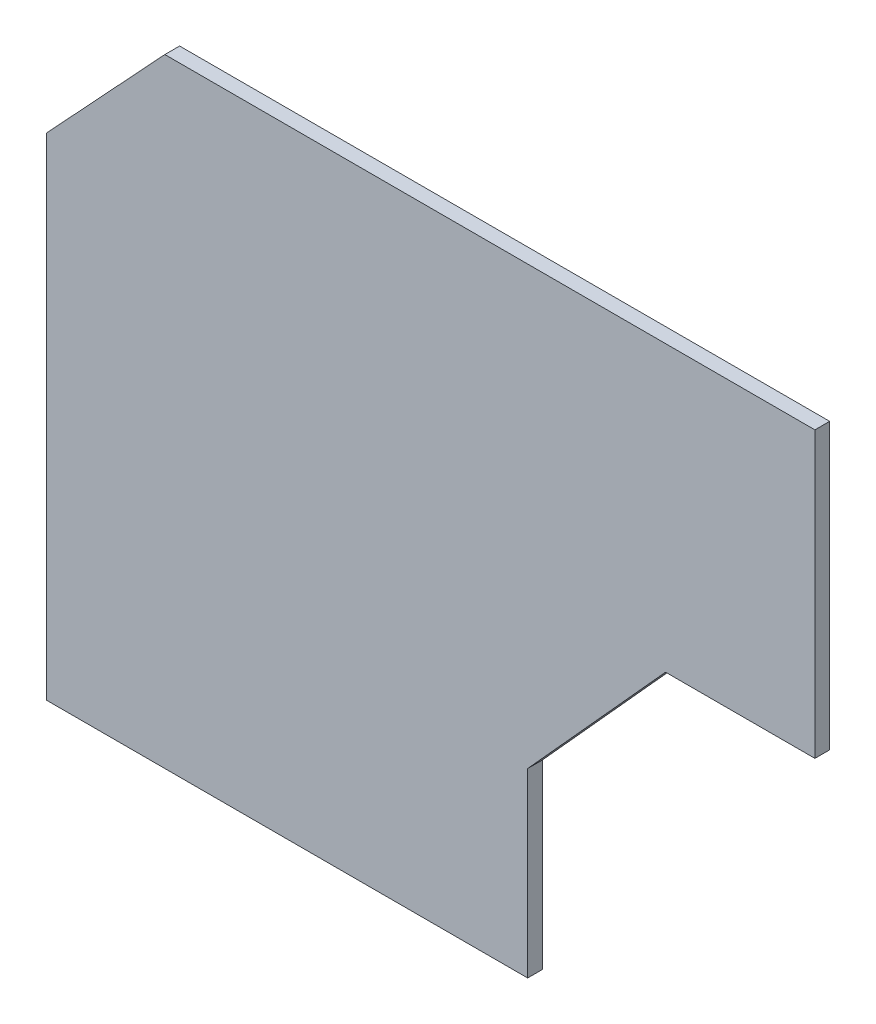
ISO-10303-21;
HEADER;
FILE_DESCRIPTION(('STEP AP214'),'2;1');
FILE_NAME('part.step','',(''),(''),'','','');
FILE_SCHEMA(('AUTOMOTIVE_DESIGN { 1 0 10303 214 1 1 1 1 }'));
ENDSEC;
DATA;
#1=APPLICATION_CONTEXT('core data for automotive mechanical design processes');
#2=APPLICATION_PROTOCOL_DEFINITION('international standard','automotive_design',2000,#1);
#3=PRODUCT_CONTEXT('',#1,'mechanical');
#4=PRODUCT('Part','Part','',(#3));
#5=PRODUCT_RELATED_PRODUCT_CATEGORY('part','',(#4));
#6=PRODUCT_DEFINITION_FORMATION('','',#4);
#7=PRODUCT_DEFINITION_CONTEXT('part definition',#1,'design');
#8=PRODUCT_DEFINITION('design','',#6,#7);
#9=PRODUCT_DEFINITION_SHAPE('','',#8);
#10=(LENGTH_UNIT() NAMED_UNIT(*) SI_UNIT(.MILLI.,.METRE.));
#11=(NAMED_UNIT(*) PLANE_ANGLE_UNIT() SI_UNIT($,.RADIAN.));
#12=(NAMED_UNIT(*) SI_UNIT($,.STERADIAN.) SOLID_ANGLE_UNIT());
#13=UNCERTAINTY_MEASURE_WITH_UNIT(LENGTH_MEASURE(1.E-05),#10,'distance_accuracy_value','');
#14=(GEOMETRIC_REPRESENTATION_CONTEXT(3) GLOBAL_UNCERTAINTY_ASSIGNED_CONTEXT((#13)) GLOBAL_UNIT_ASSIGNED_CONTEXT((#10,
#11,#12)) REPRESENTATION_CONTEXT('',''));
#15=CARTESIAN_POINT('',(0.,0.,0.));
#16=DIRECTION('',(0.,0.,1.));
#17=DIRECTION('',(1.,0.,0.));
#18=AXIS2_PLACEMENT_3D('',#15,#16,#17);
#19=CARTESIAN_POINT('',(-104.012014782512,-83.6777879037961,2.));
#20=DIRECTION('',(1.,0.,0.));
#21=DIRECTION('',(0.,0.,-1.));
#22=AXIS2_PLACEMENT_3D('',#19,#20,#21);
#23=PLANE('',#22);
#24=DIRECTION('',(0.,-1.,0.));
#25=VECTOR('',#24,1.);
#26=CARTESIAN_POINT('',(-104.012014782512,-83.6777879037961,0.));
#27=LINE('',#26,#25);
#28=CARTESIAN_POINT('',(-104.012014782512,-17.2283713863176,0.));
#29=VERTEX_POINT('',#28);
#30=CARTESIAN_POINT('',(-104.012014782512,-83.6777879037961,0.));
#31=VERTEX_POINT('',#30);
#32=EDGE_CURVE('E140',#29,#31,#27,.T.);
#33=ORIENTED_EDGE('',*,*,#32,.T.);
#34=DIRECTION('',(0.,0.,-1.));
#35=VECTOR('',#34,1.);
#36=CARTESIAN_POINT('',(-104.012014782512,-83.6777879037961,2.));
#37=LINE('',#36,#35);
#38=CARTESIAN_POINT('',(-104.012014782512,-83.6777879037961,2.));
#39=VERTEX_POINT('',#38);
#40=EDGE_CURVE('E11',#39,#31,#37,.T.);
#41=ORIENTED_EDGE('',*,*,#40,.F.);
#42=DIRECTION('',(0.,-1.,0.));
#43=VECTOR('',#42,1.);
#44=CARTESIAN_POINT('',(-104.012014782512,-83.6777879037961,2.));
#45=LINE('',#44,#43);
#46=CARTESIAN_POINT('',(-104.012014782512,-17.2283713863176,2.));
#47=VERTEX_POINT('',#46);
#48=EDGE_CURVE('E162',#47,#39,#45,.T.);
#49=ORIENTED_EDGE('',*,*,#48,.F.);
#50=DIRECTION('',(0.,0.,-1.));
#51=VECTOR('',#50,1.);
#52=CARTESIAN_POINT('',(-104.012014782512,-17.2283713863176,2.));
#53=LINE('',#52,#51);
#54=EDGE_CURVE('E136',#47,#29,#53,.T.);
#55=ORIENTED_EDGE('',*,*,#54,.T.);
#56=EDGE_LOOP('',(#33,#41,#49,#55));
#57=FACE_BOUND('',#56,.T.);
#58=ADVANCED_FACE('F39',(#57),#23,.F.);
#59=CARTESIAN_POINT('',(-38.8719463737525,-83.677787903796,2.));
#60=DIRECTION('',(0.,1.,0.));
#61=DIRECTION('',(-1.,0.,0.));
#62=AXIS2_PLACEMENT_3D('',#59,#60,#61);
#63=PLANE('',#62);
#64=DIRECTION('',(1.,0.,0.));
#65=VECTOR('',#64,1.);
#66=CARTESIAN_POINT('',(-38.8719463737525,-83.677787903796,0.));
#67=LINE('',#66,#65);
#68=CARTESIAN_POINT('',(-38.8719463737525,-83.677787903796,0.));
#69=VERTEX_POINT('',#68);
#70=EDGE_CURVE('E144',#31,#69,#67,.T.);
#71=ORIENTED_EDGE('',*,*,#70,.T.);
#72=DIRECTION('',(0.,0.,-1.));
#73=VECTOR('',#72,1.);
#74=CARTESIAN_POINT('',(-38.8719463737525,-83.677787903796,2.));
#75=LINE('',#74,#73);
#76=CARTESIAN_POINT('',(-38.8719463737525,-83.677787903796,2.));
#77=VERTEX_POINT('',#76);
#78=EDGE_CURVE('E48',#77,#69,#75,.T.);
#79=ORIENTED_EDGE('',*,*,#78,.F.);
#80=DIRECTION('',(1.,0.,0.));
#81=VECTOR('',#80,1.);
#82=CARTESIAN_POINT('',(-38.8719463737525,-83.677787903796,2.));
#83=LINE('',#82,#81);
#84=EDGE_CURVE('E99',#39,#77,#83,.T.);
#85=ORIENTED_EDGE('',*,*,#84,.F.);
#86=ORIENTED_EDGE('',*,*,#40,.T.);
#87=EDGE_LOOP('',(#71,#79,#85,#86));
#88=FACE_BOUND('',#87,.T.);
#89=ADVANCED_FACE('F208',(#88),#63,.F.);
#90=CARTESIAN_POINT('',(-38.8719463737525,-59.1275108653188,2.));
#91=DIRECTION('',(-1.,0.,0.));
#92=DIRECTION('',(0.,0.,1.));
#93=AXIS2_PLACEMENT_3D('',#90,#91,#92);
#94=PLANE('',#93);
#95=DIRECTION('',(0.,1.,0.));
#96=VECTOR('',#95,1.);
#97=CARTESIAN_POINT('',(-38.8719463737525,-59.1275108653188,0.));
#98=LINE('',#97,#96);
#99=CARTESIAN_POINT('',(-38.8719463737525,-59.1275108653188,0.));
#100=VERTEX_POINT('',#99);
#101=EDGE_CURVE('E147',#69,#100,#98,.T.);
#102=ORIENTED_EDGE('',*,*,#101,.T.);
#103=DIRECTION('',(0.,0.,-1.));
#104=VECTOR('',#103,1.);
#105=CARTESIAN_POINT('',(-38.8719463737525,-59.1275108653188,2.));
#106=LINE('',#105,#104);
#107=CARTESIAN_POINT('',(-38.8719463737525,-59.1275108653188,2.));
#108=VERTEX_POINT('',#107);
#109=EDGE_CURVE('E173',#108,#100,#106,.T.);
#110=ORIENTED_EDGE('',*,*,#109,.F.);
#111=DIRECTION('',(0.,1.,0.));
#112=VECTOR('',#111,1.);
#113=CARTESIAN_POINT('',(-38.8719463737525,-59.1275108653188,2.));
#114=LINE('',#113,#112);
#115=EDGE_CURVE('E183',#77,#108,#114,.T.);
#116=ORIENTED_EDGE('',*,*,#115,.F.);
#117=ORIENTED_EDGE('',*,*,#78,.T.);
#118=EDGE_LOOP('',(#102,#110,#116,#117));
#119=FACE_BOUND('',#118,.T.);
#120=ADVANCED_FACE('F181',(#119),#94,.F.);
#121=CARTESIAN_POINT('',(-20.2137358245098,-38.5052781529979,2.));
#122=DIRECTION('',(-0.741535779123772,0.670913323969126,0.));
#123=DIRECTION('',(-0.670913323969126,-0.741535779123772,0.));
#124=AXIS2_PLACEMENT_3D('',#121,#122,#123);
#125=PLANE('',#124);
#126=DIRECTION('',(0.670913323969126,0.741535779123772,0.));
#127=VECTOR('',#126,1.);
#128=CARTESIAN_POINT('',(-20.2137358245098,-38.5052781529979,0.));
#129=LINE('',#128,#127);
#130=CARTESIAN_POINT('',(-20.2137358245098,-38.5052781529979,0.));
#131=VERTEX_POINT('',#130);
#132=EDGE_CURVE('E150',#100,#131,#129,.T.);
#133=ORIENTED_EDGE('',*,*,#132,.T.);
#134=DIRECTION('',(0.,0.,-1.));
#135=VECTOR('',#134,1.);
#136=CARTESIAN_POINT('',(-20.2137358245098,-38.5052781529979,2.));
#137=LINE('',#136,#135);
#138=CARTESIAN_POINT('',(-20.2137358245098,-38.5052781529979,2.));
#139=VERTEX_POINT('',#138);
#140=EDGE_CURVE('E169',#139,#131,#137,.T.);
#141=ORIENTED_EDGE('',*,*,#140,.F.);
#142=DIRECTION('',(0.670913323969126,0.741535779123772,0.));
#143=VECTOR('',#142,1.);
#144=CARTESIAN_POINT('',(-20.2137358245098,-38.5052781529979,2.));
#145=LINE('',#144,#143);
#146=EDGE_CURVE('E196',#108,#139,#145,.T.);
#147=ORIENTED_EDGE('',*,*,#146,.F.);
#148=ORIENTED_EDGE('',*,*,#109,.T.);
#149=EDGE_LOOP('',(#133,#141,#147,#148));
#150=FACE_BOUND('',#149,.T.);
#151=ADVANCED_FACE('F191',(#150),#125,.F.);
#152=CARTESIAN_POINT('',(0.,-38.5052781529979,2.));
#153=DIRECTION('',(0.,1.,0.));
#154=DIRECTION('',(0.,0.,1.));
#155=AXIS2_PLACEMENT_3D('',#152,#153,#154);
#156=PLANE('',#155);
#157=DIRECTION('',(1.,0.,0.));
#158=VECTOR('',#157,1.);
#159=CARTESIAN_POINT('',(0.,-38.5052781529979,0.));
#160=LINE('',#159,#158);
#161=CARTESIAN_POINT('',(0.,-38.5052781529979,0.));
#162=VERTEX_POINT('',#161);
#163=EDGE_CURVE('E153',#131,#162,#160,.T.);
#164=ORIENTED_EDGE('',*,*,#163,.T.);
#165=DIRECTION('',(0.,0.,-1.));
#166=VECTOR('',#165,1.);
#167=CARTESIAN_POINT('',(0.,-38.5052781529979,2.));
#168=LINE('',#167,#166);
#169=CARTESIAN_POINT('',(0.,-38.5052781529979,2.));
#170=VERTEX_POINT('',#169);
#171=EDGE_CURVE('E129',#170,#162,#168,.T.);
#172=ORIENTED_EDGE('',*,*,#171,.F.);
#173=DIRECTION('',(1.,0.,0.));
#174=VECTOR('',#173,1.);
#175=CARTESIAN_POINT('',(0.,-38.5052781529979,2.));
#176=LINE('',#175,#174);
#177=EDGE_CURVE('E118',#139,#170,#176,.T.);
#178=ORIENTED_EDGE('',*,*,#177,.F.);
#179=ORIENTED_EDGE('',*,*,#140,.T.);
#180=EDGE_LOOP('',(#164,#172,#178,#179));
#181=FACE_BOUND('',#180,.T.);
#182=ADVANCED_FACE('F194',(#181),#156,.F.);
#183=CARTESIAN_POINT('',(0.,0.,2.));
#184=DIRECTION('',(-1.,0.,0.));
#185=DIRECTION('',(0.,0.,1.));
#186=AXIS2_PLACEMENT_3D('',#183,#184,#185);
#187=PLANE('',#186);
#188=DIRECTION('',(0.,1.,0.));
#189=VECTOR('',#188,1.);
#190=CARTESIAN_POINT('',(0.,0.,0.));
#191=LINE('',#190,#189);
#192=CARTESIAN_POINT('',(0.,0.,0.));
#193=VERTEX_POINT('',#192);
#194=EDGE_CURVE('E127',#162,#193,#191,.T.);
#195=ORIENTED_EDGE('',*,*,#194,.T.);
#196=DIRECTION('',(0.,0.,-1.));
#197=VECTOR('',#196,1.);
#198=CARTESIAN_POINT('',(0.,0.,2.));
#199=LINE('',#198,#197);
#200=CARTESIAN_POINT('',(0.,0.,2.));
#201=VERTEX_POINT('',#200);
#202=EDGE_CURVE('E124',#201,#193,#199,.T.);
#203=ORIENTED_EDGE('',*,*,#202,.F.);
#204=DIRECTION('',(0.,1.,0.));
#205=VECTOR('',#204,1.);
#206=CARTESIAN_POINT('',(0.,0.,2.));
#207=LINE('',#206,#205);
#208=EDGE_CURVE('E112',#170,#201,#207,.T.);
#209=ORIENTED_EDGE('',*,*,#208,.F.);
#210=ORIENTED_EDGE('',*,*,#171,.T.);
#211=EDGE_LOOP('',(#195,#203,#209,#210));
#212=FACE_BOUND('',#211,.T.);
#213=ADVANCED_FACE('F125',(#212),#187,.F.);
#214=CARTESIAN_POINT('',(-87.972500450707,0.,2.));
#215=DIRECTION('',(0.,-1.,0.));
#216=DIRECTION('',(0.,0.,-1.));
#217=AXIS2_PLACEMENT_3D('',#214,#215,#216);
#218=PLANE('',#217);
#219=DIRECTION('',(-1.,0.,0.));
#220=VECTOR('',#219,1.);
#221=CARTESIAN_POINT('',(-87.972500450707,0.,0.));
#222=LINE('',#221,#220);
#223=CARTESIAN_POINT('',(-87.972500450707,0.,0.));
#224=VERTEX_POINT('',#223);
#225=EDGE_CURVE('E85',#193,#224,#222,.T.);
#226=ORIENTED_EDGE('',*,*,#225,.T.);
#227=DIRECTION('',(0.,0.,-1.));
#228=VECTOR('',#227,1.);
#229=CARTESIAN_POINT('',(-87.972500450707,0.,2.));
#230=LINE('',#229,#228);
#231=CARTESIAN_POINT('',(-87.972500450707,0.,2.));
#232=VERTEX_POINT('',#231);
#233=EDGE_CURVE('E130',#232,#224,#230,.T.);
#234=ORIENTED_EDGE('',*,*,#233,.F.);
#235=DIRECTION('',(-1.,0.,0.));
#236=VECTOR('',#235,1.);
#237=CARTESIAN_POINT('',(-87.972500450707,0.,2.));
#238=LINE('',#237,#236);
#239=EDGE_CURVE('E116',#201,#232,#238,.T.);
#240=ORIENTED_EDGE('',*,*,#239,.F.);
#241=ORIENTED_EDGE('',*,*,#202,.T.);
#242=EDGE_LOOP('',(#226,#234,#240,#241));
#243=FACE_BOUND('',#242,.T.);
#244=ADVANCED_FACE('F132',(#243),#218,.F.);
#245=CARTESIAN_POINT('',(-104.012014782512,-17.2283713863176,2.));
#246=DIRECTION('',(0.731908667850479,-0.681402745757116,0.));
#247=DIRECTION('',(0.681402745757116,0.731908667850479,0.));
#248=AXIS2_PLACEMENT_3D('',#245,#246,#247);
#249=PLANE('',#248);
#250=DIRECTION('',(-0.681402745757116,-0.73190866785048,0.));
#251=VECTOR('',#250,1.);
#252=CARTESIAN_POINT('',(-104.012014782512,-17.2283713863176,0.));
#253=LINE('',#252,#251);
#254=EDGE_CURVE('E91',#224,#29,#253,.T.);
#255=ORIENTED_EDGE('',*,*,#254,.T.);
#256=ORIENTED_EDGE('',*,*,#54,.F.);
#257=DIRECTION('',(-0.681402745757116,-0.73190866785048,0.));
#258=VECTOR('',#257,1.);
#259=CARTESIAN_POINT('',(-104.012014782512,-17.2283713863176,2.));
#260=LINE('',#259,#258);
#261=EDGE_CURVE('E56',#232,#47,#260,.T.);
#262=ORIENTED_EDGE('',*,*,#261,.F.);
#263=ORIENTED_EDGE('',*,*,#233,.T.);
#264=EDGE_LOOP('',(#255,#256,#262,#263));
#265=FACE_BOUND('',#264,.T.);
#266=ADVANCED_FACE('F224',(#265),#249,.F.);
#267=CARTESIAN_POINT('',(0.,0.,2.));
#268=DIRECTION('',(0.,0.,-1.));
#269=DIRECTION('',(-1.,0.,0.));
#270=AXIS2_PLACEMENT_3D('',#267,#268,#269);
#271=PLANE('',#270);
#272=ORIENTED_EDGE('',*,*,#48,.T.);
#273=ORIENTED_EDGE('',*,*,#84,.T.);
#274=ORIENTED_EDGE('',*,*,#115,.T.);
#275=ORIENTED_EDGE('',*,*,#146,.T.);
#276=ORIENTED_EDGE('',*,*,#177,.T.);
#277=ORIENTED_EDGE('',*,*,#208,.T.);
#278=ORIENTED_EDGE('',*,*,#239,.T.);
#279=ORIENTED_EDGE('',*,*,#261,.T.);
#280=EDGE_LOOP('',(#272,#273,#274,#275,#276,#277,#278,#279));
#281=FACE_BOUND('',#280,.T.);
#282=ADVANCED_FACE('F114',(#281),#271,.F.);
#283=CARTESIAN_POINT('',(0.,0.,0.));
#284=DIRECTION('',(0.,0.,-1.));
#285=DIRECTION('',(-1.,0.,0.));
#286=AXIS2_PLACEMENT_3D('',#283,#284,#285);
#287=PLANE('',#286);
#288=ORIENTED_EDGE('',*,*,#32,.F.);
#289=ORIENTED_EDGE('',*,*,#254,.F.);
#290=ORIENTED_EDGE('',*,*,#225,.F.);
#291=ORIENTED_EDGE('',*,*,#194,.F.);
#292=ORIENTED_EDGE('',*,*,#163,.F.);
#293=ORIENTED_EDGE('',*,*,#132,.F.);
#294=ORIENTED_EDGE('',*,*,#101,.F.);
#295=ORIENTED_EDGE('',*,*,#70,.F.);
#296=EDGE_LOOP('',(#288,#289,#290,#291,#292,#293,#294,#295));
#297=FACE_BOUND('',#296,.T.);
#298=ADVANCED_FACE('F187',(#297),#287,.T.);
#299=CLOSED_SHELL('',(#58,#89,#120,#151,#182,#213,#244,#266,#282,#298));
#300=MANIFOLD_SOLID_BREP('B2',#299);
#301=ADVANCED_BREP_SHAPE_REPRESENTATION('',(#18,#300),#14);
#302=SHAPE_DEFINITION_REPRESENTATION(#9,#301);
ENDSEC;
END-ISO-10303-21;
